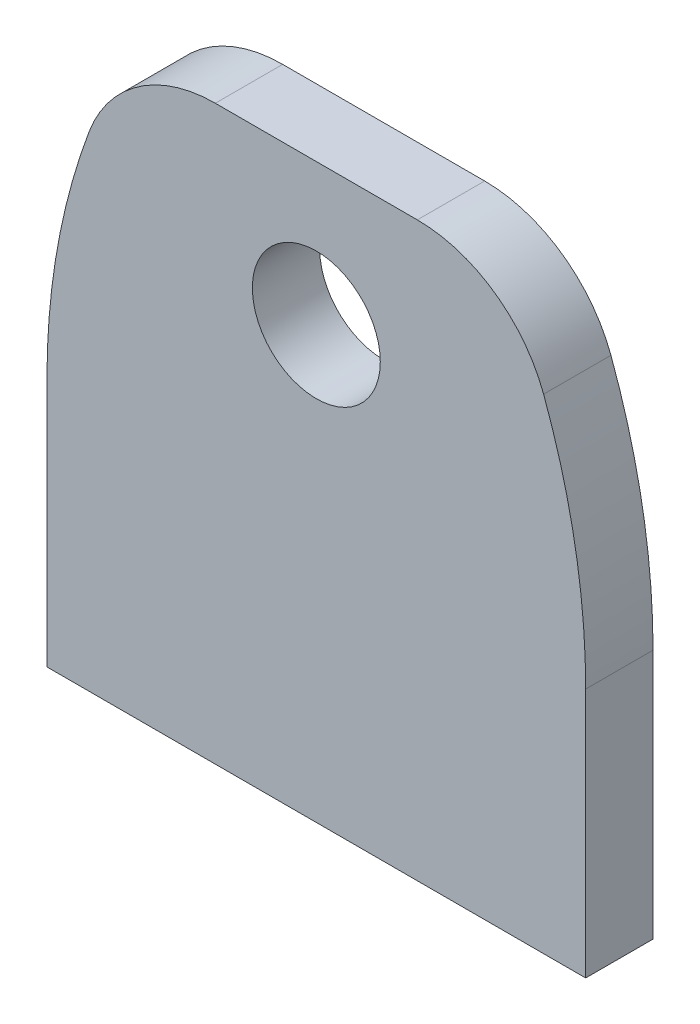
ISO-10303-21;
HEADER;
FILE_DESCRIPTION(('STEP AP214'),'2;1');
FILE_NAME('part.step','',(''),(''),'','','');
FILE_SCHEMA(('AUTOMOTIVE_DESIGN { 1 0 10303 214 1 1 1 1 }'));
ENDSEC;
DATA;
#1=APPLICATION_CONTEXT('core data for automotive mechanical design processes');
#2=APPLICATION_PROTOCOL_DEFINITION('international standard','automotive_design',2000,#1);
#3=PRODUCT_CONTEXT('',#1,'mechanical');
#4=PRODUCT('Part','Part','',(#3));
#5=PRODUCT_RELATED_PRODUCT_CATEGORY('part','',(#4));
#6=PRODUCT_DEFINITION_FORMATION('','',#4);
#7=PRODUCT_DEFINITION_CONTEXT('part definition',#1,'design');
#8=PRODUCT_DEFINITION('design','',#6,#7);
#9=PRODUCT_DEFINITION_SHAPE('','',#8);
#10=(LENGTH_UNIT() NAMED_UNIT(*) SI_UNIT(.MILLI.,.METRE.));
#11=(NAMED_UNIT(*) PLANE_ANGLE_UNIT() SI_UNIT($,.RADIAN.));
#12=(NAMED_UNIT(*) SI_UNIT($,.STERADIAN.) SOLID_ANGLE_UNIT());
#13=UNCERTAINTY_MEASURE_WITH_UNIT(LENGTH_MEASURE(1.E-05),#10,'distance_accuracy_value','');
#14=(GEOMETRIC_REPRESENTATION_CONTEXT(3) GLOBAL_UNCERTAINTY_ASSIGNED_CONTEXT((#13)) GLOBAL_UNIT_ASSIGNED_CONTEXT((#10,
#11,#12)) REPRESENTATION_CONTEXT('',''));
#15=CARTESIAN_POINT('',(0.,0.,0.));
#16=DIRECTION('',(0.,0.,1.));
#17=DIRECTION('',(1.,0.,0.));
#18=AXIS2_PLACEMENT_3D('',#15,#16,#17);
#19=CARTESIAN_POINT('',(100.,37.1611781858499,10.));
#20=DIRECTION('',(0.,0.,-1.));
#21=DIRECTION('',(-1.,0.,0.));
#22=AXIS2_PLACEMENT_3D('',#19,#20,#21);
#23=PLANE('',#22);
#24=DIRECTION('',(1.,0.,0.));
#25=VECTOR('',#24,1.);
#26=CARTESIAN_POINT('',(80.,0.,10.));
#27=LINE('',#26,#25);
#28=CARTESIAN_POINT('',(0.,0.,10.));
#29=VERTEX_POINT('',#28);
#30=CARTESIAN_POINT('',(80.,0.,10.));
#31=VERTEX_POINT('',#30);
#32=EDGE_CURVE('E145',#29,#31,#27,.T.);
#33=ORIENTED_EDGE('',*,*,#32,.T.);
#34=DIRECTION('',(0.,1.,0.));
#35=VECTOR('',#34,1.);
#36=CARTESIAN_POINT('',(80.,0.,10.));
#37=LINE('',#36,#35);
#38=CARTESIAN_POINT('',(80.,37.1611781858499,10.));
#39=VERTEX_POINT('',#38);
#40=EDGE_CURVE('E93',#31,#39,#37,.T.);
#41=ORIENTED_EDGE('',*,*,#40,.T.);
#42=CARTESIAN_POINT('',(-20.,37.1611781858499,10.));
#43=DIRECTION('',(0.,0.,1.));
#44=DIRECTION('',(1.,0.,0.));
#45=AXIS2_PLACEMENT_3D('',#42,#43,#44);
#46=CIRCLE('',#45,100.);
#47=CARTESIAN_POINT('',(73.75,71.9597054535375,10.));
#48=VERTEX_POINT('',#47);
#49=EDGE_CURVE('E160',#39,#48,#46,.T.);
#50=ORIENTED_EDGE('',*,*,#49,.T.);
#51=CARTESIAN_POINT('',(55.,65.,10.));
#52=DIRECTION('',(0.,0.,1.));
#53=DIRECTION('',(1.,0.,0.));
#54=AXIS2_PLACEMENT_3D('',#51,#52,#53);
#55=CIRCLE('',#54,20.);
#56=CARTESIAN_POINT('',(55.,85.,10.));
#57=VERTEX_POINT('',#56);
#58=EDGE_CURVE('E172',#48,#57,#55,.T.);
#59=ORIENTED_EDGE('',*,*,#58,.T.);
#60=DIRECTION('',(-1.,0.,0.));
#61=VECTOR('',#60,1.);
#62=CARTESIAN_POINT('',(25.,85.,10.));
#63=LINE('',#62,#61);
#64=CARTESIAN_POINT('',(25.,85.,10.));
#65=VERTEX_POINT('',#64);
#66=EDGE_CURVE('E112',#57,#65,#63,.T.);
#67=ORIENTED_EDGE('',*,*,#66,.T.);
#68=CARTESIAN_POINT('',(25.,65.,10.));
#69=DIRECTION('',(0.,0.,1.));
#70=DIRECTION('',(-1.,0.,0.));
#71=AXIS2_PLACEMENT_3D('',#68,#69,#70);
#72=CIRCLE('',#71,20.);
#73=CARTESIAN_POINT('',(6.24999999999999,71.9597054535376,10.));
#74=VERTEX_POINT('',#73);
#75=EDGE_CURVE('E106',#65,#74,#72,.T.);
#76=ORIENTED_EDGE('',*,*,#75,.T.);
#77=CARTESIAN_POINT('',(100.,37.1611781858499,10.));
#78=DIRECTION('',(0.,0.,1.));
#79=DIRECTION('',(-1.,0.,0.));
#80=AXIS2_PLACEMENT_3D('',#77,#78,#79);
#81=CIRCLE('',#80,100.);
#82=CARTESIAN_POINT('',(0.,37.1611781858499,10.));
#83=VERTEX_POINT('',#82);
#84=EDGE_CURVE('E110',#74,#83,#81,.T.);
#85=ORIENTED_EDGE('',*,*,#84,.T.);
#86=DIRECTION('',(0.,-1.,0.));
#87=VECTOR('',#86,1.);
#88=CARTESIAN_POINT('',(0.,0.,10.));
#89=LINE('',#88,#87);
#90=EDGE_CURVE('E50',#83,#29,#89,.T.);
#91=ORIENTED_EDGE('',*,*,#90,.T.);
#92=EDGE_LOOP('',(#33,#41,#50,#59,#67,#76,#85,#91));
#93=FACE_BOUND('',#92,.T.);
#94=CARTESIAN_POINT('',(40.,64.,10.));
#95=DIRECTION('',(0.,0.,1.));
#96=DIRECTION('',(1.,0.,0.));
#97=AXIS2_PLACEMENT_3D('',#94,#95,#96);
#98=CIRCLE('',#97,9.49999999999999);
#99=CARTESIAN_POINT('',(49.5,64.,10.));
#100=VERTEX_POINT('',#99);
#101=EDGE_CURVE('E180',#100,#100,#98,.T.);
#102=ORIENTED_EDGE('',*,*,#101,.F.);
#103=EDGE_LOOP('',(#102));
#104=FACE_BOUND('',#103,.T.);
#105=ADVANCED_FACE('F33',(#93,#104),#23,.F.);
#106=CARTESIAN_POINT('',(80.,0.,10.));
#107=DIRECTION('',(0.,1.,0.));
#108=DIRECTION('',(-1.,0.,0.));
#109=AXIS2_PLACEMENT_3D('',#106,#107,#108);
#110=PLANE('',#109);
#111=DIRECTION('',(1.,0.,0.));
#112=VECTOR('',#111,1.);
#113=CARTESIAN_POINT('',(80.,0.,0.));
#114=LINE('',#113,#112);
#115=CARTESIAN_POINT('',(0.,0.,0.));
#116=VERTEX_POINT('',#115);
#117=CARTESIAN_POINT('',(80.,0.,0.));
#118=VERTEX_POINT('',#117);
#119=EDGE_CURVE('E130',#116,#118,#114,.T.);
#120=ORIENTED_EDGE('',*,*,#119,.T.);
#121=DIRECTION('',(0.,0.,-1.));
#122=VECTOR('',#121,1.);
#123=CARTESIAN_POINT('',(80.,0.,10.));
#124=LINE('',#123,#122);
#125=EDGE_CURVE('E11',#31,#118,#124,.T.);
#126=ORIENTED_EDGE('',*,*,#125,.F.);
#127=ORIENTED_EDGE('',*,*,#32,.F.);
#128=DIRECTION('',(0.,0.,-1.));
#129=VECTOR('',#128,1.);
#130=CARTESIAN_POINT('',(0.,0.,10.));
#131=LINE('',#130,#129);
#132=EDGE_CURVE('E126',#29,#116,#131,.T.);
#133=ORIENTED_EDGE('',*,*,#132,.T.);
#134=EDGE_LOOP('',(#120,#126,#127,#133));
#135=FACE_BOUND('',#134,.T.);
#136=ADVANCED_FACE('F35',(#135),#110,.F.);
#137=CARTESIAN_POINT('',(80.,0.,10.));
#138=DIRECTION('',(-1.,0.,0.));
#139=DIRECTION('',(0.,0.,1.));
#140=AXIS2_PLACEMENT_3D('',#137,#138,#139);
#141=PLANE('',#140);
#142=DIRECTION('',(0.,1.,0.));
#143=VECTOR('',#142,1.);
#144=CARTESIAN_POINT('',(80.,0.,0.));
#145=LINE('',#144,#143);
#146=CARTESIAN_POINT('',(80.,37.1611781858499,0.));
#147=VERTEX_POINT('',#146);
#148=EDGE_CURVE('E133',#118,#147,#145,.T.);
#149=ORIENTED_EDGE('',*,*,#148,.T.);
#150=DIRECTION('',(0.,0.,-1.));
#151=VECTOR('',#150,1.);
#152=CARTESIAN_POINT('',(80.,37.1611781858499,10.));
#153=LINE('',#152,#151);
#154=EDGE_CURVE('E42',#39,#147,#153,.T.);
#155=ORIENTED_EDGE('',*,*,#154,.F.);
#156=ORIENTED_EDGE('',*,*,#40,.F.);
#157=ORIENTED_EDGE('',*,*,#125,.T.);
#158=EDGE_LOOP('',(#149,#155,#156,#157));
#159=FACE_BOUND('',#158,.T.);
#160=ADVANCED_FACE('F191',(#159),#141,.F.);
#161=CARTESIAN_POINT('',(-20.,37.1611781858499,10.));
#162=DIRECTION('',(0.,0.,-1.));
#163=DIRECTION('',(-1.,0.,0.));
#164=AXIS2_PLACEMENT_3D('',#161,#162,#163);
#165=CYLINDRICAL_SURFACE('',#164,100.);
#166=CARTESIAN_POINT('',(-20.,37.1611781858499,0.));
#167=DIRECTION('',(0.,0.,1.));
#168=DIRECTION('',(1.,0.,0.));
#169=AXIS2_PLACEMENT_3D('',#166,#167,#168);
#170=CIRCLE('',#169,100.);
#171=CARTESIAN_POINT('',(73.75,71.9597054535375,0.));
#172=VERTEX_POINT('',#171);
#173=EDGE_CURVE('E136',#147,#172,#170,.T.);
#174=ORIENTED_EDGE('',*,*,#173,.T.);
#175=DIRECTION('',(0.,0.,-1.));
#176=VECTOR('',#175,1.);
#177=CARTESIAN_POINT('',(73.75,71.9597054535375,10.));
#178=LINE('',#177,#176);
#179=EDGE_CURVE('E152',#48,#172,#178,.T.);
#180=ORIENTED_EDGE('',*,*,#179,.F.);
#181=ORIENTED_EDGE('',*,*,#49,.F.);
#182=ORIENTED_EDGE('',*,*,#154,.T.);
#183=EDGE_LOOP('',(#174,#180,#181,#182));
#184=FACE_BOUND('',#183,.T.);
#185=ADVANCED_FACE('F158',(#184),#165,.T.);
#186=CARTESIAN_POINT('',(55.,65.,10.));
#187=DIRECTION('',(0.,0.,-1.));
#188=DIRECTION('',(-1.,0.,0.));
#189=AXIS2_PLACEMENT_3D('',#186,#187,#188);
#190=CYLINDRICAL_SURFACE('',#189,20.);
#191=CARTESIAN_POINT('',(55.,65.,0.));
#192=DIRECTION('',(0.,0.,1.));
#193=DIRECTION('',(1.,0.,0.));
#194=AXIS2_PLACEMENT_3D('',#191,#192,#193);
#195=CIRCLE('',#194,20.);
#196=CARTESIAN_POINT('',(55.,85.,0.));
#197=VERTEX_POINT('',#196);
#198=EDGE_CURVE('E138',#172,#197,#195,.T.);
#199=ORIENTED_EDGE('',*,*,#198,.T.);
#200=DIRECTION('',(0.,0.,-1.));
#201=VECTOR('',#200,1.);
#202=CARTESIAN_POINT('',(55.,85.,10.));
#203=LINE('',#202,#201);
#204=EDGE_CURVE('E149',#57,#197,#203,.T.);
#205=ORIENTED_EDGE('',*,*,#204,.F.);
#206=ORIENTED_EDGE('',*,*,#58,.F.);
#207=ORIENTED_EDGE('',*,*,#179,.T.);
#208=EDGE_LOOP('',(#199,#205,#206,#207));
#209=FACE_BOUND('',#208,.T.);
#210=ADVANCED_FACE('F168',(#209),#190,.T.);
#211=CARTESIAN_POINT('',(25.,85.,10.));
#212=DIRECTION('',(0.,-1.,0.));
#213=DIRECTION('',(0.,0.,-1.));
#214=AXIS2_PLACEMENT_3D('',#211,#212,#213);
#215=PLANE('',#214);
#216=DIRECTION('',(-1.,0.,0.));
#217=VECTOR('',#216,1.);
#218=CARTESIAN_POINT('',(25.,85.,0.));
#219=LINE('',#218,#217);
#220=CARTESIAN_POINT('',(25.,85.,0.));
#221=VERTEX_POINT('',#220);
#222=EDGE_CURVE('E140',#197,#221,#219,.T.);
#223=ORIENTED_EDGE('',*,*,#222,.T.);
#224=DIRECTION('',(0.,0.,-1.));
#225=VECTOR('',#224,1.);
#226=CARTESIAN_POINT('',(25.,85.,10.));
#227=LINE('',#226,#225);
#228=EDGE_CURVE('E121',#65,#221,#227,.T.);
#229=ORIENTED_EDGE('',*,*,#228,.F.);
#230=ORIENTED_EDGE('',*,*,#66,.F.);
#231=ORIENTED_EDGE('',*,*,#204,.T.);
#232=EDGE_LOOP('',(#223,#229,#230,#231));
#233=FACE_BOUND('',#232,.T.);
#234=ADVANCED_FACE('F171',(#233),#215,.F.);
#235=CARTESIAN_POINT('',(25.,65.,10.));
#236=DIRECTION('',(0.,0.,-1.));
#237=DIRECTION('',(-1.,0.,0.));
#238=AXIS2_PLACEMENT_3D('',#235,#236,#237);
#239=CYLINDRICAL_SURFACE('',#238,20.);
#240=CARTESIAN_POINT('',(25.,65.,0.));
#241=DIRECTION('',(0.,0.,1.));
#242=DIRECTION('',(-1.,0.,0.));
#243=AXIS2_PLACEMENT_3D('',#240,#241,#242);
#244=CIRCLE('',#243,20.);
#245=CARTESIAN_POINT('',(6.24999999999999,71.9597054535376,0.));
#246=VERTEX_POINT('',#245);
#247=EDGE_CURVE('E120',#221,#246,#244,.T.);
#248=ORIENTED_EDGE('',*,*,#247,.T.);
#249=DIRECTION('',(0.,0.,-1.));
#250=VECTOR('',#249,1.);
#251=CARTESIAN_POINT('',(6.24999999999999,71.9597054535376,10.));
#252=LINE('',#251,#250);
#253=EDGE_CURVE('E117',#74,#246,#252,.T.);
#254=ORIENTED_EDGE('',*,*,#253,.F.);
#255=ORIENTED_EDGE('',*,*,#75,.F.);
#256=ORIENTED_EDGE('',*,*,#228,.T.);
#257=EDGE_LOOP('',(#248,#254,#255,#256));
#258=FACE_BOUND('',#257,.T.);
#259=ADVANCED_FACE('F118',(#258),#239,.T.);
#260=CARTESIAN_POINT('',(100.,37.1611781858499,10.));
#261=DIRECTION('',(0.,0.,-1.));
#262=DIRECTION('',(-1.,0.,0.));
#263=AXIS2_PLACEMENT_3D('',#260,#261,#262);
#264=CYLINDRICAL_SURFACE('',#263,100.);
#265=CARTESIAN_POINT('',(100.,37.1611781858499,0.));
#266=DIRECTION('',(0.,0.,1.));
#267=DIRECTION('',(-1.,0.,0.));
#268=AXIS2_PLACEMENT_3D('',#265,#266,#267);
#269=CIRCLE('',#268,100.);
#270=CARTESIAN_POINT('',(0.,37.1611781858499,0.));
#271=VERTEX_POINT('',#270);
#272=EDGE_CURVE('E79',#246,#271,#269,.T.);
#273=ORIENTED_EDGE('',*,*,#272,.T.);
#274=DIRECTION('',(0.,0.,-1.));
#275=VECTOR('',#274,1.);
#276=CARTESIAN_POINT('',(0.,37.1611781858499,10.));
#277=LINE('',#276,#275);
#278=EDGE_CURVE('E122',#83,#271,#277,.T.);
#279=ORIENTED_EDGE('',*,*,#278,.F.);
#280=ORIENTED_EDGE('',*,*,#84,.F.);
#281=ORIENTED_EDGE('',*,*,#253,.T.);
#282=EDGE_LOOP('',(#273,#279,#280,#281));
#283=FACE_BOUND('',#282,.T.);
#284=ADVANCED_FACE('F124',(#283),#264,.T.);
#285=CARTESIAN_POINT('',(0.,0.,10.));
#286=DIRECTION('',(1.,0.,0.));
#287=DIRECTION('',(0.,1.,0.));
#288=AXIS2_PLACEMENT_3D('',#285,#286,#287);
#289=PLANE('',#288);
#290=DIRECTION('',(0.,-1.,0.));
#291=VECTOR('',#290,1.);
#292=CARTESIAN_POINT('',(0.,0.,0.));
#293=LINE('',#292,#291);
#294=EDGE_CURVE('E85',#271,#116,#293,.T.);
#295=ORIENTED_EDGE('',*,*,#294,.T.);
#296=ORIENTED_EDGE('',*,*,#132,.F.);
#297=ORIENTED_EDGE('',*,*,#90,.F.);
#298=ORIENTED_EDGE('',*,*,#278,.T.);
#299=EDGE_LOOP('',(#295,#296,#297,#298));
#300=FACE_BOUND('',#299,.T.);
#301=ADVANCED_FACE('F197',(#300),#289,.F.);
#302=CARTESIAN_POINT('',(100.,37.1611781858499,0.));
#303=DIRECTION('',(0.,0.,-1.));
#304=DIRECTION('',(-1.,0.,0.));
#305=AXIS2_PLACEMENT_3D('',#302,#303,#304);
#306=PLANE('',#305);
#307=CARTESIAN_POINT('',(40.,64.,0.));
#308=DIRECTION('',(0.,0.,-1.));
#309=DIRECTION('',(-1.,0.,0.));
#310=AXIS2_PLACEMENT_3D('',#307,#308,#309);
#311=CIRCLE('',#310,9.49999999999999);
#312=CARTESIAN_POINT('',(30.5,64.,0.));
#313=VERTEX_POINT('',#312);
#314=EDGE_CURVE('E134',#313,#313,#311,.T.);
#315=ORIENTED_EDGE('',*,*,#314,.F.);
#316=EDGE_LOOP('',(#315));
#317=FACE_BOUND('',#316,.T.);
#318=ORIENTED_EDGE('',*,*,#119,.F.);
#319=ORIENTED_EDGE('',*,*,#294,.F.);
#320=ORIENTED_EDGE('',*,*,#272,.F.);
#321=ORIENTED_EDGE('',*,*,#247,.F.);
#322=ORIENTED_EDGE('',*,*,#222,.F.);
#323=ORIENTED_EDGE('',*,*,#198,.F.);
#324=ORIENTED_EDGE('',*,*,#173,.F.);
#325=ORIENTED_EDGE('',*,*,#148,.F.);
#326=EDGE_LOOP('',(#318,#319,#320,#321,#322,#323,#324,#325));
#327=FACE_BOUND('',#326,.T.);
#328=ADVANCED_FACE('F164',(#317,#327),#306,.T.);
#329=CARTESIAN_POINT('',(40.,64.,10.));
#330=DIRECTION('',(0.,0.,1.));
#331=DIRECTION('',(1.,0.,0.));
#332=AXIS2_PLACEMENT_3D('',#329,#330,#331);
#333=CYLINDRICAL_SURFACE('',#332,9.49999999999999);
#334=ORIENTED_EDGE('',*,*,#101,.T.);
#335=EDGE_LOOP('',(#334));
#336=FACE_BOUND('',#335,.T.);
#337=ORIENTED_EDGE('',*,*,#314,.T.);
#338=EDGE_LOOP('',(#337));
#339=FACE_BOUND('',#338,.T.);
#340=ADVANCED_FACE('F184',(#336,#339),#333,.F.);
#341=CLOSED_SHELL('',(#105,#136,#160,#185,#210,#234,#259,#284,#301,#328,#340));
#342=MANIFOLD_SOLID_BREP('B2',#341);
#343=ADVANCED_BREP_SHAPE_REPRESENTATION('',(#18,#342),#14);
#344=SHAPE_DEFINITION_REPRESENTATION(#9,#343);
ENDSEC;
END-ISO-10303-21;
